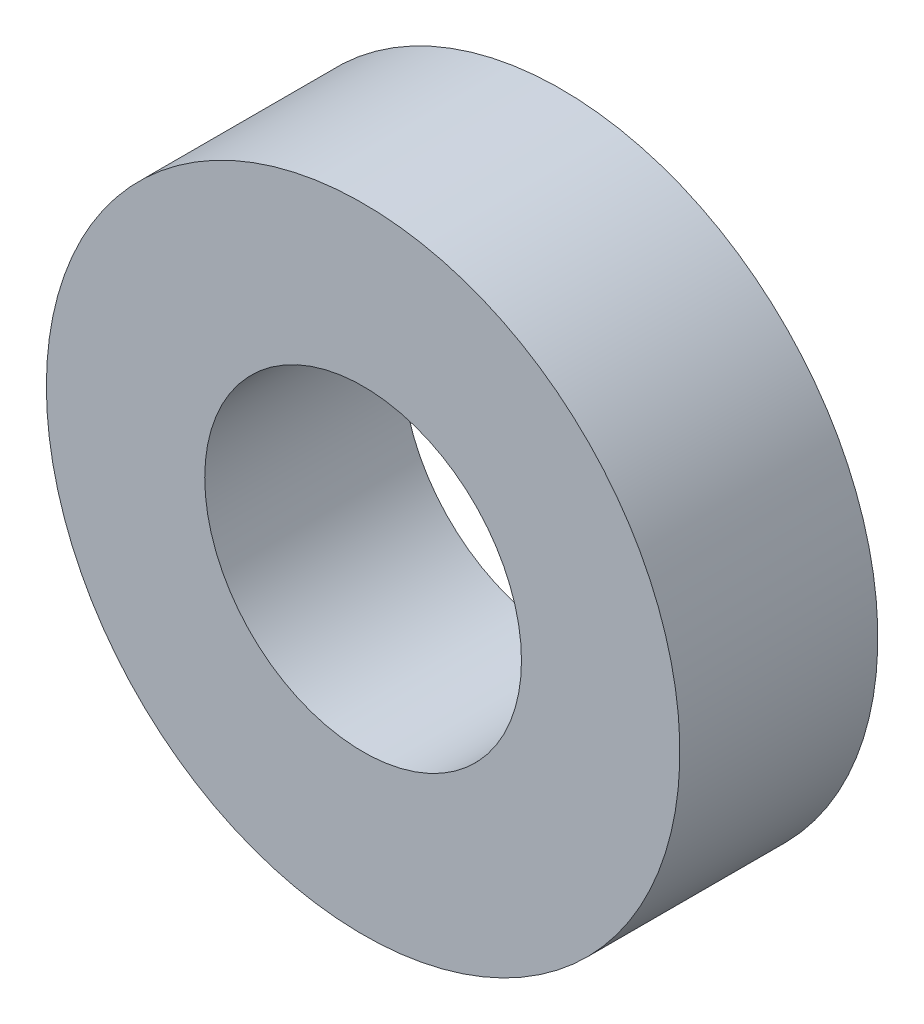
ISO-10303-21;
HEADER;
FILE_DESCRIPTION(('STEP AP214'),'2;1');
FILE_NAME('part.step','',(''),(''),'','','');
FILE_SCHEMA(('AUTOMOTIVE_DESIGN { 1 0 10303 214 1 1 1 1 }'));
ENDSEC;
DATA;
#1=APPLICATION_CONTEXT('core data for automotive mechanical design processes');
#2=APPLICATION_PROTOCOL_DEFINITION('international standard','automotive_design',2000,#1);
#3=PRODUCT_CONTEXT('',#1,'mechanical');
#4=PRODUCT('Part','Part','',(#3));
#5=PRODUCT_RELATED_PRODUCT_CATEGORY('part','',(#4));
#6=PRODUCT_DEFINITION_FORMATION('','',#4);
#7=PRODUCT_DEFINITION_CONTEXT('part definition',#1,'design');
#8=PRODUCT_DEFINITION('design','',#6,#7);
#9=PRODUCT_DEFINITION_SHAPE('','',#8);
#10=(LENGTH_UNIT() NAMED_UNIT(*) SI_UNIT(.MILLI.,.METRE.));
#11=(NAMED_UNIT(*) PLANE_ANGLE_UNIT() SI_UNIT($,.RADIAN.));
#12=(NAMED_UNIT(*) SI_UNIT($,.STERADIAN.) SOLID_ANGLE_UNIT());
#13=UNCERTAINTY_MEASURE_WITH_UNIT(LENGTH_MEASURE(1.E-05),#10,'distance_accuracy_value','');
#14=(GEOMETRIC_REPRESENTATION_CONTEXT(3) GLOBAL_UNCERTAINTY_ASSIGNED_CONTEXT((#13)) GLOBAL_UNIT_ASSIGNED_CONTEXT((#10,
#11,#12)) REPRESENTATION_CONTEXT('',''));
#15=CARTESIAN_POINT('',(0.,0.,0.));
#16=DIRECTION('',(0.,0.,1.));
#17=DIRECTION('',(1.,0.,0.));
#18=AXIS2_PLACEMENT_3D('',#15,#16,#17);
#19=CARTESIAN_POINT('',(-6.38378239159465E-13,-7.7715611723761E-13,3.17499999999998));
#20=DIRECTION('',(0.,0.,0.999999999999994));
#21=DIRECTION('',(1.00000000000001,0.,0.));
#22=AXIS2_PLACEMENT_3D('',#19,#20,#21);
#23=PLANE('',#22);
#24=CARTESIAN_POINT('',(-6.38378239159465E-13,-7.7715611723761E-13,3.17499999999998));
#25=DIRECTION('',(0.,0.,0.999999999999994));
#26=DIRECTION('',(1.00000000000001,0.,0.));
#27=AXIS2_PLACEMENT_3D('',#24,#25,#26);
#28=CIRCLE('',#27,5.08);
#29=CARTESIAN_POINT('',(-5.08000000000067,-7.76874120589355E-13,3.17499999999998));
#30=VERTEX_POINT('',#29);
#31=EDGE_CURVE('E10',#30,#30,#28,.T.);
#32=ORIENTED_EDGE('',*,*,#31,.T.);
#33=EDGE_LOOP('',(#32));
#34=FACE_BOUND('',#33,.T.);
#35=CARTESIAN_POINT('',(-6.38378239159465E-13,-7.7715611723761E-13,3.17499999999998));
#36=DIRECTION('',(0.,0.,0.999999999999994));
#37=DIRECTION('',(1.00000000000001,0.,0.));
#38=AXIS2_PLACEMENT_3D('',#35,#36,#37);
#39=CIRCLE('',#38,2.54);
#40=CARTESIAN_POINT('',(-2.54000000000066,-7.77015118913482E-13,3.17499999999998));
#41=VERTEX_POINT('',#40);
#42=EDGE_CURVE('E50',#41,#41,#39,.T.);
#43=ORIENTED_EDGE('',*,*,#42,.F.);
#44=EDGE_LOOP('',(#43));
#45=FACE_BOUND('',#44,.T.);
#46=ADVANCED_FACE('F36',(#34,#45),#23,.T.);
#47=CARTESIAN_POINT('',(0.,0.,0.));
#48=DIRECTION('',(0.,0.,0.999999999999994));
#49=DIRECTION('',(1.00000000000001,0.,0.));
#50=AXIS2_PLACEMENT_3D('',#47,#48,#49);
#51=PLANE('',#50);
#52=CARTESIAN_POINT('',(0.,0.,0.));
#53=DIRECTION('',(0.,0.,0.999999999999994));
#54=DIRECTION('',(1.00000000000001,0.,0.));
#55=AXIS2_PLACEMENT_3D('',#52,#53,#54);
#56=CIRCLE('',#55,5.08);
#57=CARTESIAN_POINT('',(-5.08000000000067,-7.76874120589355E-13,0.));
#58=VERTEX_POINT('',#57);
#59=EDGE_CURVE('E40',#58,#58,#56,.T.);
#60=ORIENTED_EDGE('',*,*,#59,.F.);
#61=EDGE_LOOP('',(#60));
#62=FACE_BOUND('',#61,.T.);
#63=CARTESIAN_POINT('',(0.,0.,0.));
#64=DIRECTION('',(0.,0.,0.999999999999994));
#65=DIRECTION('',(1.00000000000001,0.,0.));
#66=AXIS2_PLACEMENT_3D('',#63,#64,#65);
#67=CIRCLE('',#66,2.54);
#68=CARTESIAN_POINT('',(-2.54000000000066,-7.77015118913482E-13,0.));
#69=VERTEX_POINT('',#68);
#70=EDGE_CURVE('E52',#69,#69,#67,.T.);
#71=ORIENTED_EDGE('',*,*,#70,.T.);
#72=EDGE_LOOP('',(#71));
#73=FACE_BOUND('',#72,.T.);
#74=ADVANCED_FACE('F65',(#62,#73),#51,.F.);
#75=CARTESIAN_POINT('',(-6.38378239159465E-13,-7.7715611723761E-13,3.17499999999998));
#76=DIRECTION('',(0.,0.,-0.999999999999994));
#77=DIRECTION('',(-1.00000000000001,0.,0.));
#78=AXIS2_PLACEMENT_3D('',#75,#76,#77);
#79=CYLINDRICAL_SURFACE('',#78,5.08);
#80=CARTESIAN_POINT('',(-5.08000000000067,-7.76874120589355E-13,3.17499999999998));
#81=CARTESIAN_POINT('',(-5.08000000000067,-7.76874120589355E-13,3.14192708333332));
#82=CARTESIAN_POINT('',(-5.08000000000067,-7.76874120589355E-13,3.10885416666665));
#83=CARTESIAN_POINT('',(-5.08000000000067,-7.76874120589355E-13,3.04270833333332));
#84=CARTESIAN_POINT('',(-5.08000000000067,-7.76874120589355E-13,3.00963541666665));
#85=CARTESIAN_POINT('',(-5.08000000000067,-7.76874120589355E-13,2.94348958333332));
#86=CARTESIAN_POINT('',(-5.08000000000067,-7.76874120589355E-13,2.91041666666665));
#87=CARTESIAN_POINT('',(-5.08000000000067,-7.76874120589355E-13,2.84427083333332));
#88=CARTESIAN_POINT('',(-5.08000000000067,-7.76874120589355E-13,2.81119791666665));
#89=CARTESIAN_POINT('',(-5.08000000000067,-7.76874120589355E-13,2.74505208333332));
#90=CARTESIAN_POINT('',(-5.08000000000067,-7.76874120589355E-13,2.71197916666665));
#91=CARTESIAN_POINT('',(-5.08000000000067,-7.76874120589355E-13,2.64583333333332));
#92=CARTESIAN_POINT('',(-5.08000000000067,-7.76874120589355E-13,2.61276041666665));
#93=CARTESIAN_POINT('',(-5.08000000000067,-7.76874120589355E-13,2.54661458333332));
#94=CARTESIAN_POINT('',(-5.08000000000067,-7.76874120589355E-13,2.51354166666665));
#95=CARTESIAN_POINT('',(-5.08000000000067,-7.76874120589355E-13,2.44739583333332));
#96=CARTESIAN_POINT('',(-5.08000000000067,-7.76874120589355E-13,2.41432291666665));
#97=CARTESIAN_POINT('',(-5.08000000000067,-7.76874120589355E-13,2.34817708333332));
#98=CARTESIAN_POINT('',(-5.08000000000067,-7.76874120589355E-13,2.31510416666665));
#99=CARTESIAN_POINT('',(-5.08000000000067,-7.76874120589355E-13,2.24895833333332));
#100=CARTESIAN_POINT('',(-5.08000000000067,-7.76874120589355E-13,2.21588541666666));
#101=CARTESIAN_POINT('',(-5.08000000000067,-7.76874120589355E-13,2.14973958333332));
#102=CARTESIAN_POINT('',(-5.08000000000067,-7.76874120589355E-13,2.11666666666666));
#103=CARTESIAN_POINT('',(-5.08000000000067,-7.76874120589355E-13,2.05052083333332));
#104=CARTESIAN_POINT('',(-5.08000000000067,-7.76874120589355E-13,2.01744791666666));
#105=CARTESIAN_POINT('',(-5.08000000000067,-7.76874120589355E-13,1.95130208333332));
#106=CARTESIAN_POINT('',(-5.08000000000067,-7.76874120589355E-13,1.91822916666666));
#107=CARTESIAN_POINT('',(-5.08000000000067,-7.76874120589355E-13,1.85208333333332));
#108=CARTESIAN_POINT('',(-5.08000000000067,-7.76874120589355E-13,1.81901041666666));
#109=CARTESIAN_POINT('',(-5.08000000000067,-7.76874120589355E-13,1.75286458333332));
#110=CARTESIAN_POINT('',(-5.08000000000067,-7.76874120589355E-13,1.71979166666666));
#111=CARTESIAN_POINT('',(-5.08000000000067,-7.76874120589355E-13,1.65364583333332));
#112=CARTESIAN_POINT('',(-5.08000000000067,-7.76874120589355E-13,1.62057291666666));
#113=CARTESIAN_POINT('',(-5.08000000000067,-7.76874120589355E-13,1.55442708333332));
#114=CARTESIAN_POINT('',(-5.08000000000067,-7.76874120589355E-13,1.52135416666666));
#115=CARTESIAN_POINT('',(-5.08000000000067,-7.76874120589355E-13,1.45520833333333));
#116=CARTESIAN_POINT('',(-5.08000000000067,-7.76874120589355E-13,1.42213541666666));
#117=CARTESIAN_POINT('',(-5.08000000000067,-7.76874120589355E-13,1.35598958333333));
#118=CARTESIAN_POINT('',(-5.08000000000067,-7.76874120589355E-13,1.32291666666666));
#119=CARTESIAN_POINT('',(-5.08000000000067,-7.76874120589355E-13,1.25677083333333));
#120=CARTESIAN_POINT('',(-5.08000000000067,-7.76874120589355E-13,1.22369791666666));
#121=CARTESIAN_POINT('',(-5.08000000000067,-7.76874120589355E-13,1.15755208333333));
#122=CARTESIAN_POINT('',(-5.08000000000067,-7.76874120589355E-13,1.12447916666666));
#123=CARTESIAN_POINT('',(-5.08000000000067,-7.76874120589355E-13,1.05833333333333));
#124=CARTESIAN_POINT('',(-5.08000000000067,-7.76874120589355E-13,1.02526041666666));
#125=CARTESIAN_POINT('',(-5.08000000000067,-7.76874120589355E-13,0.959114583333328));
#126=CARTESIAN_POINT('',(-5.08000000000067,-7.76874120589355E-13,0.926041666666661));
#127=CARTESIAN_POINT('',(-5.08000000000067,-7.76874120589355E-13,0.859895833333328));
#128=CARTESIAN_POINT('',(-5.08000000000067,-7.76874120589355E-13,0.826822916666662));
#129=CARTESIAN_POINT('',(-5.08000000000067,-7.76874120589355E-13,0.760677083333329));
#130=CARTESIAN_POINT('',(-5.08000000000067,-7.76874120589355E-13,0.727604166666662));
#131=CARTESIAN_POINT('',(-5.08000000000067,-7.76874120589355E-13,0.661458333333329));
#132=CARTESIAN_POINT('',(-5.08000000000067,-7.76874120589355E-13,0.628385416666663));
#133=CARTESIAN_POINT('',(-5.08000000000067,-7.76874120589355E-13,0.56223958333333));
#134=CARTESIAN_POINT('',(-5.08000000000067,-7.76874120589355E-13,0.529166666666663));
#135=CARTESIAN_POINT('',(-5.08000000000067,-7.76874120589355E-13,0.46302083333333));
#136=CARTESIAN_POINT('',(-5.08000000000067,-7.76874120589355E-13,0.429947916666664));
#137=CARTESIAN_POINT('',(-5.08000000000067,-7.76874120589355E-13,0.363802083333331));
#138=CARTESIAN_POINT('',(-5.08000000000067,-7.76874120589355E-13,0.330729166666665));
#139=CARTESIAN_POINT('',(-5.08000000000067,-7.76874120589355E-13,0.264583333333332));
#140=CARTESIAN_POINT('',(-5.08000000000067,-7.76874120589355E-13,0.231510416666665));
#141=CARTESIAN_POINT('',(-5.08000000000067,-7.76874120589355E-13,0.165364583333332));
#142=CARTESIAN_POINT('',(-5.08000000000067,-7.76874120589355E-13,0.132291666666666));
#143=CARTESIAN_POINT('',(-5.08000000000067,-7.76874120589355E-13,0.0661458333333326));
#144=CARTESIAN_POINT('',(-5.08000000000067,-7.76874120589355E-13,0.033072916666666));
#145=CARTESIAN_POINT('',(-5.08000000000067,-7.76874120589355E-13,0.));
#146=B_SPLINE_CURVE_WITH_KNOTS('',3,(#80,#81,#82,#83,#84,#85,#86,#87,#88,#89,#90,#91,#92,#93,
#94,#95,#96,#97,#98,#99,#100,#101,#102,#103,#104,#105,#106,#107,#108,#109,#110,#111,#112,#113,
#114,#115,#116,#117,#118,#119,#120,#121,#122,#123,#124,#125,#126,#127,#128,#129,#130,#131,#132,
#133,#134,#135,#136,#137,#138,#139,#140,#141,#142,#143,#144,#145),.UNSPECIFIED.,.F.,.F.,(4,2,2,
2,2,2,2,2,2,2,2,2,2,2,2,2,2,2,2,2,2,2,2,2,2,2,2,2,2,2,2,2,4),(0.,0.0992187499999991,
0.198437499999999,0.297656249999998,0.396874999999997,0.496093749999997,0.595312499999996,
0.694531249999996,0.793749999999995,0.892968749999995,0.992187499999994,1.09140624999999,
1.19062499999999,1.28984374999999,1.38906249999999,1.48828124999999,1.58749999999999,
1.68671874999999,1.78593749999999,1.88515624999999,1.98437499999999,2.08359374999999,
2.18281249999999,2.28203124999999,2.38124999999999,2.48046874999999,2.57968749999999,
2.67890624999999,2.77812499999999,2.87734374999998,2.97656249999998,3.07578124999998,
3.17499999999998),.UNSPECIFIED.);
#147=EDGE_CURVE('BSEAM38',#30,#58,#146,.T.);
#148=ORIENTED_EDGE('',*,*,#31,.F.);
#149=ORIENTED_EDGE('',*,*,#59,.T.);
#150=ORIENTED_EDGE('',*,*,#147,.T.);
#151=ORIENTED_EDGE('',*,*,#147,.F.);
#152=EDGE_LOOP('',(#148,#150,#149,#151));
#153=FACE_BOUND('',#152,.T.);
#154=ADVANCED_FACE('F38',(#153),#79,.T.);
#155=CARTESIAN_POINT('',(-6.38378239159465E-13,-7.7715611723761E-13,3.17499999999998));
#156=DIRECTION('',(0.,0.,-0.999999999999994));
#157=DIRECTION('',(-1.00000000000001,0.,0.));
#158=AXIS2_PLACEMENT_3D('',#155,#156,#157);
#159=CYLINDRICAL_SURFACE('',#158,2.54);
#160=CARTESIAN_POINT('',(-2.54000000000066,-7.77015118913482E-13,3.17499999999998));
#161=CARTESIAN_POINT('',(-2.54000000000066,-7.77015118913482E-13,3.14192708333332));
#162=CARTESIAN_POINT('',(-2.54000000000066,-7.77015118913482E-13,3.10885416666665));
#163=CARTESIAN_POINT('',(-2.54000000000066,-7.77015118913482E-13,3.04270833333332));
#164=CARTESIAN_POINT('',(-2.54000000000066,-7.77015118913482E-13,3.00963541666665));
#165=CARTESIAN_POINT('',(-2.54000000000066,-7.77015118913482E-13,2.94348958333332));
#166=CARTESIAN_POINT('',(-2.54000000000066,-7.77015118913482E-13,2.91041666666665));
#167=CARTESIAN_POINT('',(-2.54000000000066,-7.77015118913482E-13,2.84427083333332));
#168=CARTESIAN_POINT('',(-2.54000000000066,-7.77015118913482E-13,2.81119791666665));
#169=CARTESIAN_POINT('',(-2.54000000000066,-7.77015118913482E-13,2.74505208333332));
#170=CARTESIAN_POINT('',(-2.54000000000066,-7.77015118913482E-13,2.71197916666665));
#171=CARTESIAN_POINT('',(-2.54000000000066,-7.77015118913482E-13,2.64583333333332));
#172=CARTESIAN_POINT('',(-2.54000000000066,-7.77015118913482E-13,2.61276041666665));
#173=CARTESIAN_POINT('',(-2.54000000000066,-7.77015118913482E-13,2.54661458333332));
#174=CARTESIAN_POINT('',(-2.54000000000066,-7.77015118913482E-13,2.51354166666665));
#175=CARTESIAN_POINT('',(-2.54000000000066,-7.77015118913482E-13,2.44739583333332));
#176=CARTESIAN_POINT('',(-2.54000000000066,-7.77015118913482E-13,2.41432291666665));
#177=CARTESIAN_POINT('',(-2.54000000000066,-7.77015118913482E-13,2.34817708333332));
#178=CARTESIAN_POINT('',(-2.54000000000066,-7.77015118913482E-13,2.31510416666665));
#179=CARTESIAN_POINT('',(-2.54000000000066,-7.77015118913482E-13,2.24895833333332));
#180=CARTESIAN_POINT('',(-2.54000000000066,-7.77015118913482E-13,2.21588541666665));
#181=CARTESIAN_POINT('',(-2.54000000000066,-7.77015118913482E-13,2.14973958333332));
#182=CARTESIAN_POINT('',(-2.54000000000066,-7.77015118913482E-13,2.11666666666666));
#183=CARTESIAN_POINT('',(-2.54000000000066,-7.77015118913482E-13,2.05052083333332));
#184=CARTESIAN_POINT('',(-2.54000000000066,-7.77015118913482E-13,2.01744791666666));
#185=CARTESIAN_POINT('',(-2.54000000000066,-7.77015118913482E-13,1.95130208333332));
#186=CARTESIAN_POINT('',(-2.54000000000066,-7.77015118913482E-13,1.91822916666666));
#187=CARTESIAN_POINT('',(-2.54000000000066,-7.77015118913482E-13,1.85208333333332));
#188=CARTESIAN_POINT('',(-2.54000000000066,-7.77015118913482E-13,1.81901041666666));
#189=CARTESIAN_POINT('',(-2.54000000000066,-7.77015118913482E-13,1.75286458333332));
#190=CARTESIAN_POINT('',(-2.54000000000066,-7.77015118913482E-13,1.71979166666666));
#191=CARTESIAN_POINT('',(-2.54000000000066,-7.77015118913482E-13,1.65364583333332));
#192=CARTESIAN_POINT('',(-2.54000000000066,-7.77015118913482E-13,1.62057291666666));
#193=CARTESIAN_POINT('',(-2.54000000000066,-7.77015118913482E-13,1.55442708333332));
#194=CARTESIAN_POINT('',(-2.54000000000066,-7.77015118913482E-13,1.52135416666666));
#195=CARTESIAN_POINT('',(-2.54000000000066,-7.77015118913482E-13,1.45520833333333));
#196=CARTESIAN_POINT('',(-2.54000000000066,-7.77015118913482E-13,1.42213541666666));
#197=CARTESIAN_POINT('',(-2.54000000000066,-7.77015118913482E-13,1.35598958333333));
#198=CARTESIAN_POINT('',(-2.54000000000066,-7.77015118913482E-13,1.32291666666666));
#199=CARTESIAN_POINT('',(-2.54000000000066,-7.77015118913482E-13,1.25677083333333));
#200=CARTESIAN_POINT('',(-2.54000000000066,-7.77015118913482E-13,1.22369791666666));
#201=CARTESIAN_POINT('',(-2.54000000000066,-7.77015118913482E-13,1.15755208333333));
#202=CARTESIAN_POINT('',(-2.54000000000066,-7.77015118913482E-13,1.12447916666666));
#203=CARTESIAN_POINT('',(-2.54000000000066,-7.77015118913482E-13,1.05833333333333));
#204=CARTESIAN_POINT('',(-2.54000000000066,-7.77015118913482E-13,1.02526041666666));
#205=CARTESIAN_POINT('',(-2.54000000000066,-7.77015118913482E-13,0.959114583333328));
#206=CARTESIAN_POINT('',(-2.54000000000066,-7.77015118913482E-13,0.926041666666662));
#207=CARTESIAN_POINT('',(-2.54000000000066,-7.77015118913482E-13,0.859895833333329));
#208=CARTESIAN_POINT('',(-2.54000000000066,-7.77015118913482E-13,0.826822916666662));
#209=CARTESIAN_POINT('',(-2.54000000000066,-7.77015118913482E-13,0.760677083333329));
#210=CARTESIAN_POINT('',(-2.54000000000066,-7.77015118913482E-13,0.727604166666662));
#211=CARTESIAN_POINT('',(-2.54000000000066,-7.77015118913482E-13,0.661458333333329));
#212=CARTESIAN_POINT('',(-2.54000000000066,-7.77015118913482E-13,0.628385416666663));
#213=CARTESIAN_POINT('',(-2.54000000000066,-7.77015118913482E-13,0.56223958333333));
#214=CARTESIAN_POINT('',(-2.54000000000066,-7.77015118913482E-13,0.529166666666664));
#215=CARTESIAN_POINT('',(-2.54000000000066,-7.77015118913482E-13,0.463020833333331));
#216=CARTESIAN_POINT('',(-2.54000000000066,-7.77015118913482E-13,0.429947916666664));
#217=CARTESIAN_POINT('',(-2.54000000000066,-7.77015118913482E-13,0.363802083333331));
#218=CARTESIAN_POINT('',(-2.54000000000066,-7.77015118913482E-13,0.330729166666665));
#219=CARTESIAN_POINT('',(-2.54000000000066,-7.77015118913482E-13,0.264583333333332));
#220=CARTESIAN_POINT('',(-2.54000000000066,-7.77015118913482E-13,0.231510416666665));
#221=CARTESIAN_POINT('',(-2.54000000000066,-7.77015118913482E-13,0.165364583333332));
#222=CARTESIAN_POINT('',(-2.54000000000066,-7.77015118913482E-13,0.132291666666666));
#223=CARTESIAN_POINT('',(-2.54000000000066,-7.77015118913482E-13,0.0661458333333328));
#224=CARTESIAN_POINT('',(-2.54000000000066,-7.77015118913482E-13,0.0330729166666662));
#225=CARTESIAN_POINT('',(-2.54000000000066,-7.77015118913482E-13,0.));
#226=B_SPLINE_CURVE_WITH_KNOTS('',3,(#160,#161,#162,#163,#164,#165,#166,#167,#168,#169,#170,
#171,#172,#173,#174,#175,#176,#177,#178,#179,#180,#181,#182,#183,#184,#185,#186,#187,#188,#189,
#190,#191,#192,#193,#194,#195,#196,#197,#198,#199,#200,#201,#202,#203,#204,#205,#206,#207,#208,
#209,#210,#211,#212,#213,#214,#215,#216,#217,#218,#219,#220,#221,#222,#223,#224,#225),
.UNSPECIFIED.,.F.,.F.,(4,2,2,2,2,2,2,2,2,2,2,2,2,2,2,2,2,2,2,2,2,2,2,2,2,2,2,2,2,2,2,2,4),(0.,
0.0992187499999999,0.198437499999999,0.297656249999999,0.396874999999998,0.496093749999998,
0.595312499999997,0.694531249999997,0.793749999999996,0.892968749999996,0.992187499999995,
1.09140624999999,1.19062499999999,1.28984374999999,1.38906249999999,1.48828124999999,
1.58749999999999,1.68671874999999,1.78593749999999,1.88515624999999,1.98437499999999,
2.08359374999999,2.18281249999999,2.28203124999999,2.38124999999999,2.48046874999999,
2.57968749999999,2.67890624999999,2.77812499999999,2.87734374999999,2.97656249999998,
3.07578124999998,3.17499999999998),.UNSPECIFIED.);
#227=EDGE_CURVE('BSEAM61',#41,#69,#226,.T.);
#228=ORIENTED_EDGE('',*,*,#42,.T.);
#229=ORIENTED_EDGE('',*,*,#70,.F.);
#230=ORIENTED_EDGE('',*,*,#227,.T.);
#231=ORIENTED_EDGE('',*,*,#227,.F.);
#232=EDGE_LOOP('',(#228,#230,#229,#231));
#233=FACE_BOUND('',#232,.T.);
#234=ADVANCED_FACE('F61',(#233),#159,.F.);
#235=CLOSED_SHELL('',(#46,#74,#154,#234));
#236=MANIFOLD_SOLID_BREP('B2',#235);
#237=ADVANCED_BREP_SHAPE_REPRESENTATION('',(#18,#236),#14);
#238=SHAPE_DEFINITION_REPRESENTATION(#9,#237);
ENDSEC;
END-ISO-10303-21;
